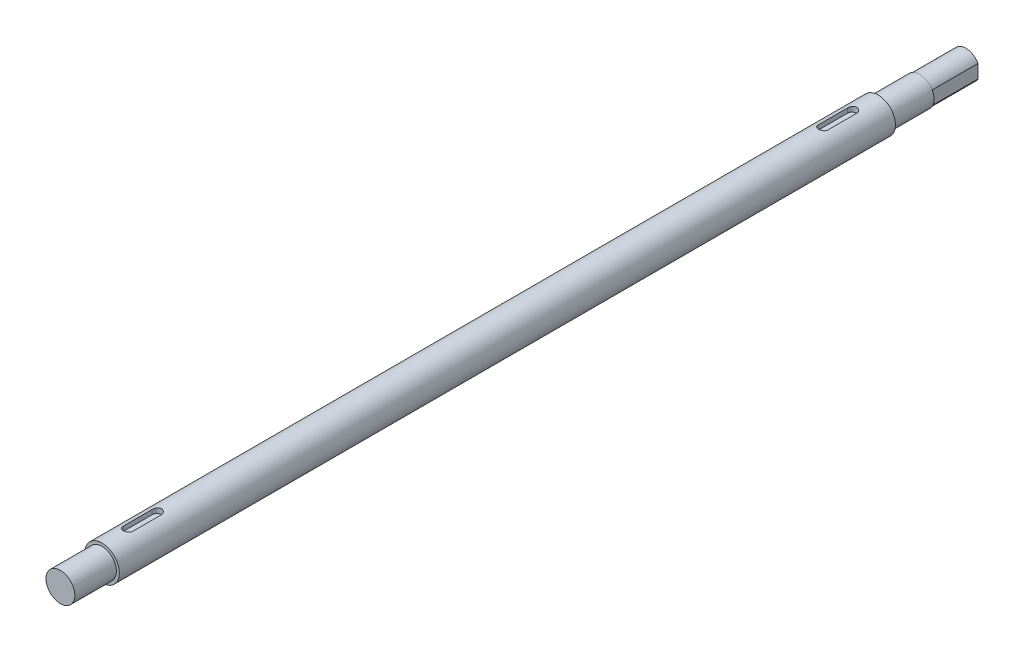
ISO-10303-21;
HEADER;
FILE_DESCRIPTION(('STEP AP214'),'2;1');
FILE_NAME('part.step','',(''),(''),'','','');
FILE_SCHEMA(('AUTOMOTIVE_DESIGN { 1 0 10303 214 1 1 1 1 }'));
ENDSEC;
DATA;
#1=APPLICATION_CONTEXT('core data for automotive mechanical design processes');
#2=APPLICATION_PROTOCOL_DEFINITION('international standard','automotive_design',2000,#1);
#3=PRODUCT_CONTEXT('',#1,'mechanical');
#4=PRODUCT('Part','Part','',(#3));
#5=PRODUCT_RELATED_PRODUCT_CATEGORY('part','',(#4));
#6=PRODUCT_DEFINITION_FORMATION('','',#4);
#7=PRODUCT_DEFINITION_CONTEXT('part definition',#1,'design');
#8=PRODUCT_DEFINITION('design','',#6,#7);
#9=PRODUCT_DEFINITION_SHAPE('','',#8);
#10=(LENGTH_UNIT() NAMED_UNIT(*) SI_UNIT(.MILLI.,.METRE.));
#11=(NAMED_UNIT(*) PLANE_ANGLE_UNIT() SI_UNIT($,.RADIAN.));
#12=(NAMED_UNIT(*) SI_UNIT($,.STERADIAN.) SOLID_ANGLE_UNIT());
#13=UNCERTAINTY_MEASURE_WITH_UNIT(LENGTH_MEASURE(1.E-05),#10,'distance_accuracy_value','');
#14=(GEOMETRIC_REPRESENTATION_CONTEXT(3) GLOBAL_UNCERTAINTY_ASSIGNED_CONTEXT((#13)) GLOBAL_UNIT_ASSIGNED_CONTEXT((#10,
#11,#12)) REPRESENTATION_CONTEXT('',''));
#15=CARTESIAN_POINT('',(0.,0.,0.));
#16=DIRECTION('',(0.,0.,1.));
#17=DIRECTION('',(1.,0.,0.));
#18=AXIS2_PLACEMENT_3D('',#15,#16,#17);
#19=CARTESIAN_POINT('',(0.,0.,-36.));
#20=DIRECTION('',(0.,0.,-1.));
#21=DIRECTION('',(-1.,0.,0.));
#22=AXIS2_PLACEMENT_3D('',#19,#20,#21);
#23=CYLINDRICAL_SURFACE('',#22,12.);
#24=DIRECTION('',(0.,0.,-1.));
#25=VECTOR('',#24,1.);
#26=CARTESIAN_POINT('',(-10.5,-5.80947501931113,-36.));
#27=LINE('',#26,#25);
#28=CARTESIAN_POINT('',(-10.5,-5.80947501931113,-76.));
#29=VERTEX_POINT('',#28);
#30=CARTESIAN_POINT('',(-10.5,-5.80947501931113,-36.));
#31=VERTEX_POINT('',#30);
#32=EDGE_CURVE('E249',#29,#31,#27,.F.);
#33=ORIENTED_EDGE('',*,*,#32,.F.);
#34=CARTESIAN_POINT('',(0.,0.,-76.));
#35=DIRECTION('',(0.,0.,-1.));
#36=DIRECTION('',(-1.,0.,0.));
#37=AXIS2_PLACEMENT_3D('',#34,#35,#36);
#38=CIRCLE('',#37,12.);
#39=CARTESIAN_POINT('',(10.5,-5.80947501931113,-76.));
#40=VERTEX_POINT('',#39);
#41=EDGE_CURVE('E251',#40,#29,#38,.T.);
#42=ORIENTED_EDGE('',*,*,#41,.F.);
#43=DIRECTION('',(0.,0.,-1.));
#44=VECTOR('',#43,1.);
#45=CARTESIAN_POINT('',(10.5,-5.80947501931113,-36.));
#46=LINE('',#45,#44);
#47=CARTESIAN_POINT('',(10.5,-5.80947501931113,-36.));
#48=VERTEX_POINT('',#47);
#49=EDGE_CURVE('E56',#48,#40,#46,.T.);
#50=ORIENTED_EDGE('',*,*,#49,.F.);
#51=CARTESIAN_POINT('',(0.,0.,-36.));
#52=DIRECTION('',(0.,0.,-1.));
#53=DIRECTION('',(-1.,0.,0.));
#54=AXIS2_PLACEMENT_3D('',#51,#52,#53);
#55=CIRCLE('',#54,12.);
#56=EDGE_CURVE('E145',#48,#31,#55,.T.);
#57=ORIENTED_EDGE('',*,*,#56,.T.);
#58=EDGE_LOOP('',(#33,#42,#50,#57));
#59=FACE_BOUND('',#58,.T.);
#60=ADVANCED_FACE('F40',(#59),#23,.T.);
#61=CARTESIAN_POINT('',(0.,0.,-90.));
#62=DIRECTION('',(0.,0.,1.));
#63=DIRECTION('',(1.,0.,0.));
#64=AXIS2_PLACEMENT_3D('',#61,#62,#63);
#65=CYLINDRICAL_SURFACE('',#64,12.5);
#66=CARTESIAN_POINT('',(0.,0.,0.));
#67=DIRECTION('',(0.,0.,1.));
#68=DIRECTION('',(1.,0.,0.));
#69=AXIS2_PLACEMENT_3D('',#66,#67,#68);
#70=CIRCLE('',#69,12.5);
#71=CARTESIAN_POINT('',(12.5,0.,0.));
#72=VERTEX_POINT('',#71);
#73=EDGE_CURVE('E175',#72,#72,#70,.F.);
#74=CARTESIAN_POINT('',(0.,0.,-36.));
#75=DIRECTION('',(0.,0.,-1.));
#76=DIRECTION('',(-1.,0.,0.));
#77=AXIS2_PLACEMENT_3D('',#74,#75,#76);
#78=CIRCLE('',#77,12.5);
#79=CARTESIAN_POINT('',(12.5,0.,-36.));
#80=VERTEX_POINT('',#79);
#81=EDGE_CURVE('E151',#80,#80,#78,.T.);
#82=CARTESIAN_POINT('',(12.5,0.,0.));
#83=CARTESIAN_POINT('',(12.5,0.,-0.375000000000014));
#84=CARTESIAN_POINT('',(12.5,0.,-0.750000000000015));
#85=CARTESIAN_POINT('',(12.5,0.,-1.50000000000002));
#86=CARTESIAN_POINT('',(12.5,0.,-1.87500000000002));
#87=CARTESIAN_POINT('',(12.5,0.,-2.62500000000002));
#88=CARTESIAN_POINT('',(12.5,0.,-3.00000000000002));
#89=CARTESIAN_POINT('',(12.5,0.,-3.75000000000002));
#90=CARTESIAN_POINT('',(12.5,0.,-4.12500000000002));
#91=CARTESIAN_POINT('',(12.5,0.,-4.87500000000001));
#92=CARTESIAN_POINT('',(12.5,0.,-5.25000000000001));
#93=CARTESIAN_POINT('',(12.5,0.,-6.00000000000001));
#94=CARTESIAN_POINT('',(12.5,0.,-6.37500000000001));
#95=CARTESIAN_POINT('',(12.5,0.,-7.12500000000001));
#96=CARTESIAN_POINT('',(12.5,0.,-7.50000000000001));
#97=CARTESIAN_POINT('',(12.5,0.,-8.25000000000001));
#98=CARTESIAN_POINT('',(12.5,0.,-8.62500000000001));
#99=CARTESIAN_POINT('',(12.5,0.,-9.37500000000001));
#100=CARTESIAN_POINT('',(12.5,0.,-9.75000000000001));
#101=CARTESIAN_POINT('',(12.5,0.,-10.5));
#102=CARTESIAN_POINT('',(12.5,0.,-10.875));
#103=CARTESIAN_POINT('',(12.5,0.,-11.625));
#104=CARTESIAN_POINT('',(12.5,0.,-12.));
#105=CARTESIAN_POINT('',(12.5,0.,-12.75));
#106=CARTESIAN_POINT('',(12.5,0.,-13.125));
#107=CARTESIAN_POINT('',(12.5,0.,-13.875));
#108=CARTESIAN_POINT('',(12.5,0.,-14.25));
#109=CARTESIAN_POINT('',(12.5,0.,-15.));
#110=CARTESIAN_POINT('',(12.5,0.,-15.375));
#111=CARTESIAN_POINT('',(12.5,0.,-16.125));
#112=CARTESIAN_POINT('',(12.5,0.,-16.5));
#113=CARTESIAN_POINT('',(12.5,0.,-17.25));
#114=CARTESIAN_POINT('',(12.5,0.,-17.625));
#115=CARTESIAN_POINT('',(12.5,0.,-18.375));
#116=CARTESIAN_POINT('',(12.5,0.,-18.75));
#117=CARTESIAN_POINT('',(12.5,0.,-19.5));
#118=CARTESIAN_POINT('',(12.5,0.,-19.875));
#119=CARTESIAN_POINT('',(12.5,0.,-20.625));
#120=CARTESIAN_POINT('',(12.5,0.,-21.));
#121=CARTESIAN_POINT('',(12.5,0.,-21.75));
#122=CARTESIAN_POINT('',(12.5,0.,-22.125));
#123=CARTESIAN_POINT('',(12.5,0.,-22.875));
#124=CARTESIAN_POINT('',(12.5,0.,-23.25));
#125=CARTESIAN_POINT('',(12.5,0.,-24.));
#126=CARTESIAN_POINT('',(12.5,0.,-24.375));
#127=CARTESIAN_POINT('',(12.5,0.,-25.125));
#128=CARTESIAN_POINT('',(12.5,0.,-25.5));
#129=CARTESIAN_POINT('',(12.5,0.,-26.25));
#130=CARTESIAN_POINT('',(12.5,0.,-26.625));
#131=CARTESIAN_POINT('',(12.5,0.,-27.375));
#132=CARTESIAN_POINT('',(12.5,0.,-27.75));
#133=CARTESIAN_POINT('',(12.5,0.,-28.5));
#134=CARTESIAN_POINT('',(12.5,0.,-28.875));
#135=CARTESIAN_POINT('',(12.5,0.,-29.625));
#136=CARTESIAN_POINT('',(12.5,0.,-30.));
#137=CARTESIAN_POINT('',(12.5,0.,-30.75));
#138=CARTESIAN_POINT('',(12.5,0.,-31.125));
#139=CARTESIAN_POINT('',(12.5,0.,-31.875));
#140=CARTESIAN_POINT('',(12.5,0.,-32.25));
#141=CARTESIAN_POINT('',(12.5,0.,-33.));
#142=CARTESIAN_POINT('',(12.5,0.,-33.375));
#143=CARTESIAN_POINT('',(12.5,0.,-34.125));
#144=CARTESIAN_POINT('',(12.5,0.,-34.5));
#145=CARTESIAN_POINT('',(12.5,0.,-35.25));
#146=CARTESIAN_POINT('',(12.5,0.,-35.625));
#147=CARTESIAN_POINT('',(12.5,0.,-36.));
#148=B_SPLINE_CURVE_WITH_KNOTS('',3,(#82,#83,#84,#85,#86,#87,#88,#89,#90,#91,#92,#93,#94,#95,
#96,#97,#98,#99,#100,#101,#102,#103,#104,#105,#106,#107,#108,#109,#110,#111,#112,#113,#114,#115,
#116,#117,#118,#119,#120,#121,#122,#123,#124,#125,#126,#127,#128,#129,#130,#131,#132,#133,#134,
#135,#136,#137,#138,#139,#140,#141,#142,#143,#144,#145,#146,#147),.UNSPECIFIED.,.F.,.F.,(4,2,2,
2,2,2,2,2,2,2,2,2,2,2,2,2,2,2,2,2,2,2,2,2,2,2,2,2,2,2,2,2,4),(0.,1.125,2.25,3.375,4.5,
5.62499999999999,6.74999999999999,7.87499999999999,8.99999999999999,10.125,11.25,12.375,13.5,
14.625,15.75,16.875,18.,19.125,20.25,21.375,22.5,23.625,24.75,25.875,27.,28.125,29.25,30.375,
31.5,32.625,33.75,34.875,36.),.UNSPECIFIED.);
#149=EDGE_CURVE('BSEAM222',#72,#80,#148,.T.);
#150=ORIENTED_EDGE('',*,*,#73,.T.);
#151=ORIENTED_EDGE('',*,*,#81,.F.);
#152=ORIENTED_EDGE('',*,*,#149,.T.);
#153=ORIENTED_EDGE('',*,*,#149,.F.);
#154=EDGE_LOOP('',(#150,#152,#151,#153));
#155=FACE_BOUND('',#154,.T.);
#156=ADVANCED_FACE('F222',(#155),#65,.T.);
#157=CARTESIAN_POINT('',(0.,0.,672.));
#158=DIRECTION('',(0.,0.,-1.));
#159=DIRECTION('',(-1.,0.,0.));
#160=AXIS2_PLACEMENT_3D('',#157,#158,#159);
#161=CYLINDRICAL_SURFACE('',#160,15.);
#162=CARTESIAN_POINT('',(0.,15.,653.5));
#163=CARTESIAN_POINT('',(-0.220509111665708,14.9999966762032,653.49999476613));
#164=CARTESIAN_POINT('',(-0.441074320443683,14.995089723243,653.481704771621));
#165=CARTESIAN_POINT('',(-0.875850902708934,14.9759914724332,653.409157538523));
#166=CARTESIAN_POINT('',(-1.09005916663818,14.9617957066517,653.354882991148));
#167=CARTESIAN_POINT('',(-1.50578317809062,14.9256866650558,653.212256666272));
#168=CARTESIAN_POINT('',(-1.70731490203056,14.9037833426075,653.123948824668));
#169=CARTESIAN_POINT('',(-2.09270737278531,14.8545739830336,652.915925514667));
#170=CARTESIAN_POINT('',(-2.27656694089927,14.8272675859036,652.796207953282));
#171=CARTESIAN_POINT('',(-2.62565900748008,14.7694922980399,652.525832967173));
#172=CARTESIAN_POINT('',(-2.79042337972562,14.7389693535736,652.374582663983));
#173=CARTESIAN_POINT('',(-3.09257427321279,14.6785481935918,652.046703033873));
#174=CARTESIAN_POINT('',(-3.22995726991331,14.6486500589449,651.870070444765));
#175=CARTESIAN_POINT('',(-3.47572818486831,14.5923107492874,651.492703530349));
#176=CARTESIAN_POINT('',(-3.58357755472976,14.5659377712648,651.291607343477));
#177=CARTESIAN_POINT('',(-3.76375096153989,14.5204295463637,650.873319777815));
#178=CARTESIAN_POINT('',(-3.83608154902739,14.5012929650653,650.656131375337));
#179=CARTESIAN_POINT('',(-3.94153840453008,14.472982316048,650.21700892435));
#180=CARTESIAN_POINT('',(-3.97551340489382,14.4635929562298,649.995292920139));
#181=CARTESIAN_POINT('',(-4.0059406941164,14.4551966183274,649.549124633387));
#182=CARTESIAN_POINT('',(-4.00239999411508,14.4561877002889,649.324672869952));
#183=CARTESIAN_POINT('',(-3.95857020005398,14.4682475760406,648.886029169252));
#184=CARTESIAN_POINT('',(-3.91930812129527,14.4790347102306,648.671725635923));
#185=CARTESIAN_POINT('',(-3.80679497444363,14.5090202616138,648.252863331088));
#186=CARTESIAN_POINT('',(-3.73354118985989,14.5282193510522,648.048305339849));
#187=CARTESIAN_POINT('',(-3.55428713930513,14.5731132349677,647.652063712383));
#188=CARTESIAN_POINT('',(-3.44792682275569,14.5988788563741,647.460551321428));
#189=CARTESIAN_POINT('',(-3.20573007647554,14.6539645928489,647.097731682297));
#190=CARTESIAN_POINT('',(-3.06988784448501,14.6832854071037,646.926428421687));
#191=CARTESIAN_POINT('',(-2.76733214526838,14.7433502125973,646.60302200509));
#192=CARTESIAN_POINT('',(-2.59975625456601,14.7741094297766,646.45172736337));
#193=CARTESIAN_POINT('',(-2.24123533641276,14.8327276255263,646.179222439299));
#194=CARTESIAN_POINT('',(-2.05028938841015,14.8605864897711,646.058013342595));
#195=CARTESIAN_POINT('',(-1.64919651099486,14.9104364079659,645.848764194351));
#196=CARTESIAN_POINT('',(-1.43896980510356,14.9324014566712,645.760870459103));
#197=CARTESIAN_POINT('',(-1.00600458878078,14.96780088802,645.621905622373));
#198=CARTESIAN_POINT('',(-0.783268823856604,14.981237134675,645.570826474552));
#199=CARTESIAN_POINT('',(-0.338508166290965,14.9977831711677,645.508210246164));
#200=CARTESIAN_POINT('',(-0.116648475282702,15.0011799494192,645.495573920298));
#201=CARTESIAN_POINT('',(0.326020091802439,14.9980894338339,645.507166328494));
#202=CARTESIAN_POINT('',(0.54682907412426,14.9916031616071,645.531391252212));
#203=CARTESIAN_POINT('',(0.977204899803595,14.9696607099204,645.61511689492));
#204=CARTESIAN_POINT('',(1.18689970405561,14.9543605309265,645.674004492396));
#205=CARTESIAN_POINT('',(1.59341394235218,14.9165258978828,645.824671889016));
#206=CARTESIAN_POINT('',(1.79023197843209,14.8939906599234,645.916455252501));
#207=CARTESIAN_POINT('',(2.16967694933592,14.8435132111904,646.132347774361));
#208=CARTESIAN_POINT('',(2.35195037692239,14.8154737320985,646.257054933596));
#209=CARTESIAN_POINT('',(2.69336927079432,14.7572290473119,646.534503260316));
#210=CARTESIAN_POINT('',(2.85251015759838,14.7270234145527,646.687249965202));
#211=CARTESIAN_POINT('',(3.14777848957547,14.6667949173317,647.021571154989));
#212=CARTESIAN_POINT('',(3.28313038499629,14.6368012285772,647.203837122791));
#213=CARTESIAN_POINT('',(3.52134382370244,14.5813289436636,647.589129392199));
#214=CARTESIAN_POINT('',(3.62420672244344,14.5558501591602,647.792154827244));
#215=CARTESIAN_POINT('',(3.79374823172207,14.5125853674305,648.212190614153));
#216=CARTESIAN_POINT('',(3.86063624507843,14.4947549662348,648.429111623638));
#217=CARTESIAN_POINT('',(3.95682410237658,14.4687965026614,648.871678639347));
#218=CARTESIAN_POINT('',(3.98613355205236,14.4606659608681,649.097322400687));
#219=CARTESIAN_POINT('',(4.00577979307211,14.4552348910192,649.542989575789));
#220=CARTESIAN_POINT('',(3.99736311235128,14.4575879532022,649.762954640573));
#221=CARTESIAN_POINT('',(3.94468751999859,14.4720479199639,650.198207028071));
#222=CARTESIAN_POINT('',(3.90042953069981,14.4841545735456,650.41349447101));
#223=CARTESIAN_POINT('',(3.77805031399793,14.5165514219021,650.83171150424));
#224=CARTESIAN_POINT('',(3.70019322151264,14.5367777005106,651.034723685459));
#225=CARTESIAN_POINT('',(3.51303109124665,14.5831363626058,651.424957661074));
#226=CARTESIAN_POINT('',(3.40372112049205,14.6092696723953,651.612176972602));
#227=CARTESIAN_POINT('',(3.15297818537663,14.6654584288421,651.971460718992));
#228=CARTESIAN_POINT('',(3.01069459535825,14.6956066620426,652.142917069952));
#229=CARTESIAN_POINT('',(2.69966107022187,14.7559100756513,652.459924903335));
#230=CARTESIAN_POINT('',(2.53090470871741,14.7860652559664,652.605470077338));
#231=CARTESIAN_POINT('',(2.16735996217729,14.8437562480818,652.869584475294));
#232=CARTESIAN_POINT('',(1.97209192350344,14.8712222262917,652.987510021299));
#233=CARTESIAN_POINT('',(1.56377728083368,14.9196762020573,653.188674831859));
#234=CARTESIAN_POINT('',(1.35074218939255,14.9406683536717,653.271936351327));
#235=CARTESIAN_POINT('',(0.948749409761994,14.9710950502695,653.390550570831));
#236=CARTESIAN_POINT('',(0.761524033130081,14.9818554118521,653.431498767185));
#237=CARTESIAN_POINT('',(0.382879590634158,14.9963089807291,653.486224412334));
#238=CARTESIAN_POINT('',(0.191460940809724,15.0000028859454,653.5000045444));
#239=CARTESIAN_POINT('',(0.,15.,653.5));
#240=B_SPLINE_CURVE_WITH_KNOTS('',3,(#162,#163,#164,#165,#166,#167,#168,#169,#170,#171,#172,
#173,#174,#175,#176,#177,#178,#179,#180,#181,#182,#183,#184,#185,#186,#187,#188,#189,#190,#191,
#192,#193,#194,#195,#196,#197,#198,#199,#200,#201,#202,#203,#204,#205,#206,#207,#208,#209,#210,
#211,#212,#213,#214,#215,#216,#217,#218,#219,#220,#221,#222,#223,#224,#225,#226,#227,#228,#229,
#230,#231,#232,#233,#234,#235,#236,#237,#238,#239),.UNSPECIFIED.,.T.,.F.,(4,2,2,2,2,2,2,2,2,2,2,
2,2,2,2,2,2,2,2,2,2,2,2,2,2,2,2,2,2,2,2,2,2,2,2,2,2,2,4),(0.,0.660825197899134,1.32196848752292,
1.98226110594387,2.64259773417352,3.31669795909943,3.99088489850297,4.67665165046461,
5.36229188259403,6.03244316500924,6.7024692080864,7.35382004092,8.00522293625882,8.66397346693,
9.32285376235257,10.0032251962464,10.683623438752,11.3669761920608,12.0501795438028,
12.713654350491,13.377060578507,14.0290707128423,14.6811515155123,15.346005720091,
16.0109913651778,16.6947299276557,17.3784399604821,18.0581259539879,18.7376381732797,
19.3948668481089,20.0520786104838,20.7042153090379,21.3564543425319,22.0278867914997,
22.6994824867209,23.38544504569,24.0709665229755,24.6447963799386,25.2185695593995),.UNSPECIFIED.);
#241=CARTESIAN_POINT('',(4.,14.456832294801,649.5));
#242=VERTEX_POINT('',#241);
#243=CARTESIAN_POINT('',(-4.,14.456832294801,649.5));
#244=VERTEX_POINT('',#243);
#245=EDGE_CURVE('E278',#242,#244,#240,.T.);
#246=ORIENTED_EDGE('',*,*,#245,.T.);
#247=DIRECTION('',(0.,0.,-1.));
#248=VECTOR('',#247,1.);
#249=CARTESIAN_POINT('',(-4.,14.456832294801,672.));
#250=LINE('',#249,#248);
#251=CARTESIAN_POINT('',(-4.,14.456832294801,624.5));
#252=VERTEX_POINT('',#251);
#253=EDGE_CURVE('E265',#244,#252,#250,.T.);
#254=ORIENTED_EDGE('',*,*,#253,.T.);
#255=CARTESIAN_POINT('',(-4.,14.456832294801,624.5));
#256=CARTESIAN_POINT('',(-4.00001309389174,14.4568189842467,624.389641756596));
#257=CARTESIAN_POINT('',(-3.99543311151603,14.4580956467717,624.279291478007));
#258=CARTESIAN_POINT('',(-3.97718874589727,14.4631301353516,624.059421346034));
#259=CARTESIAN_POINT('',(-3.96352604983925,14.4668875005959,623.949901342241));
#260=CARTESIAN_POINT('',(-3.92725695741265,14.4767740441058,623.732698346486));
#261=CARTESIAN_POINT('',(-3.90466984692448,14.482898107258,623.625011912152));
#262=CARTESIAN_POINT('',(-3.85076543838186,14.4973231400467,623.412025139644));
#263=CARTESIAN_POINT('',(-3.81944798699437,14.5056241479174,623.306724843415));
#264=CARTESIAN_POINT('',(-3.71275643853686,14.5334412456827,622.995536581225));
#265=CARTESIAN_POINT('',(-3.62460332607936,14.5558829598252,622.794125066453));
#266=CARTESIAN_POINT('',(-3.41695780475821,14.6060171290377,622.408979240374));
#267=CARTESIAN_POINT('',(-3.29745504324309,14.6337113178034,622.225250796028));
#268=CARTESIAN_POINT('',(-3.02730320878016,14.6920016406366,621.876029423072));
#269=CARTESIAN_POINT('',(-2.87601544465626,14.7226489452442,621.711038159034));
#270=CARTESIAN_POINT('',(-2.54795832924038,14.7829523618628,621.408442433038));
#271=CARTESIAN_POINT('',(-2.37118484921257,14.8126083123117,621.270842417132));
#272=CARTESIAN_POINT('',(-1.99367199592162,14.8681604116921,621.024827869815));
#273=CARTESIAN_POINT('',(-1.792594148434,14.8939887414057,620.916916034422));
#274=CARTESIAN_POINT('',(-1.3743557555279,14.9383834129136,620.736627111039));
#275=CARTESIAN_POINT('',(-1.15719869214844,14.9569513215518,620.664242355223));
#276=CARTESIAN_POINT('',(-0.71823430736963,14.9843709217852,620.558690174831));
#277=CARTESIAN_POINT('',(-0.496647293428073,14.9934353394137,620.524662787106));
#278=CARTESIAN_POINT('',(-0.0507319917605573,15.0015705103632,620.494085686777));
#279=CARTESIAN_POINT('',(0.17359589196347,15.0006427191926,620.497530515808));
#280=CARTESIAN_POINT('',(0.612629502642177,14.9890534931376,620.541195686368));
#281=CARTESIAN_POINT('',(0.827435206418327,14.9786381919443,620.580486127656));
#282=CARTESIAN_POINT('',(1.24728467665106,14.9495347795912,620.693225150863));
#283=CARTESIAN_POINT('',(1.45232797980577,14.9308462762364,620.766675352151));
#284=CARTESIAN_POINT('',(1.84920963545355,14.8869312076945,620.946359966253));
#285=CARTESIAN_POINT('',(2.04089626466614,14.8616414267933,621.05291337223));
#286=CARTESIAN_POINT('',(2.40398441957144,14.8072486052897,621.295542768965));
#287=CARTESIAN_POINT('',(2.57538239000348,14.7781448982353,621.431623922183));
#288=CARTESIAN_POINT('',(2.89854935036782,14.7182294237973,621.734327971101));
#289=CARTESIAN_POINT('',(3.04955722400813,14.6873926412643,621.901758007894));
#290=CARTESIAN_POINT('',(3.32161448391788,14.6282716207251,622.260042840709));
#291=CARTESIAN_POINT('',(3.44265558078024,14.5999880903709,622.450904096481));
#292=CARTESIAN_POINT('',(3.59932937334137,14.5618587427771,622.751353283365));
#293=CARTESIAN_POINT('',(3.64754371945351,14.5498268172621,622.854288915041));
#294=CARTESIAN_POINT('',(3.7350941764333,14.5275984074125,623.064046321272));
#295=CARTESIAN_POINT('',(3.77443385857867,14.5174011851057,623.170866512463));
#296=CARTESIAN_POINT('',(3.84386783810503,14.4991713081511,623.38751941922));
#297=CARTESIAN_POINT('',(3.87397173088606,14.4911364080612,623.497348878193));
#298=CARTESIAN_POINT('',(3.92471856960776,14.4774747012191,623.719275221125));
#299=CARTESIAN_POINT('',(3.94536592495321,14.4718467722231,623.83137102282));
#300=CARTESIAN_POINT('',(3.97411378733403,14.4639761334309,624.036251024718));
#301=CARTESIAN_POINT('',(3.98382319960777,14.4613012625133,624.128796446167));
#302=CARTESIAN_POINT('',(3.99676420153356,14.4577275048596,624.31422535331));
#303=CARTESIAN_POINT('',(4.00000603663185,14.4568258092259,624.407108070433));
#304=CARTESIAN_POINT('',(4.,14.456832294801,624.5));
#305=B_SPLINE_CURVE_WITH_KNOTS('',3,(#255,#256,#257,#258,#259,#260,#261,#262,#263,#264,#265,
#266,#267,#268,#269,#270,#271,#272,#273,#274,#275,#276,#277,#278,#279,#280,#281,#282,#283,#284,
#285,#286,#287,#288,#289,#290,#291,#292,#293,#294,#295,#296,#297,#298,#299,#300,#301,#302,#303,
#304),.UNSPECIFIED.,.F.,.F.,(4,2,2,2,2,2,2,2,2,2,2,2,2,2,2,2,2,2,2,2,2,2,2,2,4),(0.,
0.330958670877884,0.661855880768397,0.992041890688508,1.32223370010826,1.98190700187186,
2.64179842357619,3.31649637536141,3.99130375261111,4.67691814590525,5.36238449759355,
6.03215661862347,6.70183117906691,7.35461236515046,8.0074244999636,8.666733407937,
9.32615767867959,10.0057598785671,10.6855498604334,11.0281077435252,11.3705275300853,
11.7125903499583,12.0544935096115,12.3335333037378,12.6121307120357),.UNSPECIFIED.);
#306=CARTESIAN_POINT('',(4.,14.456832294801,624.5));
#307=VERTEX_POINT('',#306);
#308=EDGE_CURVE('E270',#252,#307,#305,.T.);
#309=ORIENTED_EDGE('',*,*,#308,.T.);
#310=DIRECTION('',(0.,0.,-1.));
#311=VECTOR('',#310,1.);
#312=CARTESIAN_POINT('',(4.,14.456832294801,672.));
#313=LINE('',#312,#311);
#314=EDGE_CURVE('E275',#307,#242,#313,.F.);
#315=ORIENTED_EDGE('',*,*,#314,.T.);
#316=EDGE_LOOP('',(#246,#254,#309,#315));
#317=FACE_BOUND('',#316,.T.);
#318=CARTESIAN_POINT('',(0.,15.,51.5));
#319=CARTESIAN_POINT('',(-0.220509111665709,14.9999966762032,51.4999947661303));
#320=CARTESIAN_POINT('',(-0.441074320443681,14.995089723243,51.4817047716207));
#321=CARTESIAN_POINT('',(-0.875850902708927,14.9759914724332,51.4091575385226));
#322=CARTESIAN_POINT('',(-1.09005916663817,14.9617957066517,51.3548829911478));
#323=CARTESIAN_POINT('',(-1.50578317809062,14.9256866650558,51.212256666272));
#324=CARTESIAN_POINT('',(-1.70731490203057,14.9037833426075,51.123948824668));
#325=CARTESIAN_POINT('',(-2.09270737278532,14.8545739830336,50.9159255146668));
#326=CARTESIAN_POINT('',(-2.27656694089925,14.8272675859036,50.7962079532815));
#327=CARTESIAN_POINT('',(-2.62565900748003,14.7694922980399,50.5258329671733));
#328=CARTESIAN_POINT('',(-2.79042337972557,14.7389693535736,50.3745826639835));
#329=CARTESIAN_POINT('',(-3.09257427321275,14.6785481935918,50.0467030338733));
#330=CARTESIAN_POINT('',(-3.22995726991328,14.6486500589449,49.870070444765));
#331=CARTESIAN_POINT('',(-3.4757281848683,14.5923107492874,49.4927035303491));
#332=CARTESIAN_POINT('',(-3.58357755472974,14.5659377712648,49.2916073434766));
#333=CARTESIAN_POINT('',(-3.76375096153988,14.5204295463637,48.8733197778152));
#334=CARTESIAN_POINT('',(-3.83608154902738,14.5012929650653,48.6561313753372));
#335=CARTESIAN_POINT('',(-3.94153840453008,14.472982316048,48.21700892435));
#336=CARTESIAN_POINT('',(-3.97551340489383,14.4635929562298,47.9952929201386));
#337=CARTESIAN_POINT('',(-4.00594069411639,14.4551966183274,47.549124633387));
#338=CARTESIAN_POINT('',(-4.00239999411507,14.4561877002889,47.3246728699519));
#339=CARTESIAN_POINT('',(-3.95857020005398,14.4682475760406,46.8860291692519));
#340=CARTESIAN_POINT('',(-3.91930812129529,14.4790347102306,46.6717256359231));
#341=CARTESIAN_POINT('',(-3.80679497444365,14.5090202616138,46.2528633310875));
#342=CARTESIAN_POINT('',(-3.73354118985989,14.5282193510523,46.0483053398493));
#343=CARTESIAN_POINT('',(-3.55428713930511,14.5731132349677,45.6520637123829));
#344=CARTESIAN_POINT('',(-3.44792682275568,14.5988788563741,45.4605513214275));
#345=CARTESIAN_POINT('',(-3.20573007647555,14.6539645928489,45.097731682297));
#346=CARTESIAN_POINT('',(-3.06988784448502,14.6832854071037,44.9264284216871));
#347=CARTESIAN_POINT('',(-2.76733214526837,14.7433502125973,44.6030220050904));
#348=CARTESIAN_POINT('',(-2.59975625456598,14.7741094297766,44.4517273633701));
#349=CARTESIAN_POINT('',(-2.24123533641274,14.8327276255263,44.1792224392995));
#350=CARTESIAN_POINT('',(-2.05028938841018,14.8605864897711,44.0580133425952));
#351=CARTESIAN_POINT('',(-1.64919651099491,14.9104364079659,43.8487641943507));
#352=CARTESIAN_POINT('',(-1.43896980510358,14.9324014566712,43.7608704591028));
#353=CARTESIAN_POINT('',(-1.00600458878079,14.96780088802,43.6219056223733));
#354=CARTESIAN_POINT('',(-0.783268823856648,14.981237134675,43.5708264745521));
#355=CARTESIAN_POINT('',(-0.338508166291031,14.9977831711677,43.5082102461644));
#356=CARTESIAN_POINT('',(-0.116648475282761,15.0011799494192,43.4955739202983));
#357=CARTESIAN_POINT('',(0.326020091802397,14.9980894338339,43.5071663284939));
#358=CARTESIAN_POINT('',(0.546829074124227,14.9916031616071,43.5313912522116));
#359=CARTESIAN_POINT('',(0.977204899803559,14.9696607099204,43.61511689492));
#360=CARTESIAN_POINT('',(1.18689970405556,14.9543605309265,43.6740044923956));
#361=CARTESIAN_POINT('',(1.59341394235213,14.9165258978828,43.8246718890159));
#362=CARTESIAN_POINT('',(1.79023197843206,14.8939906599234,43.9164552525011));
#363=CARTESIAN_POINT('',(2.1696769493359,14.8435132111904,44.1323477743611));
#364=CARTESIAN_POINT('',(2.35195037692237,14.8154737320985,44.2570549335955));
#365=CARTESIAN_POINT('',(2.6933692707943,14.7572290473119,44.534503260316));
#366=CARTESIAN_POINT('',(2.85251015759838,14.7270234145527,44.6872499652021));
#367=CARTESIAN_POINT('',(3.14777848957547,14.6667949173317,45.0215711549892));
#368=CARTESIAN_POINT('',(3.28313038499627,14.6368012285772,45.2038371227906));
#369=CARTESIAN_POINT('',(3.52134382370242,14.5813289436636,45.5891293921991));
#370=CARTESIAN_POINT('',(3.62420672244342,14.5558501591602,45.792154827244));
#371=CARTESIAN_POINT('',(3.79374823172205,14.5125853674305,46.2121906141529));
#372=CARTESIAN_POINT('',(3.8606362450784,14.4947549662348,46.4291116236376));
#373=CARTESIAN_POINT('',(3.95682410237657,14.4687965026614,46.8716786393471));
#374=CARTESIAN_POINT('',(3.98613355205236,14.4606659608681,47.0973224006868));
#375=CARTESIAN_POINT('',(4.00577979307212,14.4552348910192,47.5429895757886));
#376=CARTESIAN_POINT('',(3.99736311235129,14.4575879532022,47.7629546405733));
#377=CARTESIAN_POINT('',(3.94468751999858,14.4720479199639,48.1982070280705));
#378=CARTESIAN_POINT('',(3.9004295306998,14.4841545735456,48.4134944710096));
#379=CARTESIAN_POINT('',(3.77805031399794,14.5165514219021,48.8317115042403));
#380=CARTESIAN_POINT('',(3.70019322151266,14.5367777005106,49.0347236854592));
#381=CARTESIAN_POINT('',(3.51303109124666,14.5831363626058,49.4249576610735));
#382=CARTESIAN_POINT('',(3.40372112049204,14.6092696723953,49.6121769726024));
#383=CARTESIAN_POINT('',(3.15297818537663,14.6654584288421,49.9714607189918));
#384=CARTESIAN_POINT('',(3.01069459535826,14.6956066620426,50.1429170699521));
#385=CARTESIAN_POINT('',(2.69966107022191,14.7559100756513,50.4599249033351));
#386=CARTESIAN_POINT('',(2.53090470871747,14.7860652559664,50.6054700773378));
#387=CARTESIAN_POINT('',(2.16735996217739,14.8437562480818,50.8695844752936));
#388=CARTESIAN_POINT('',(1.97209192350356,14.8712222262917,50.9875100212987));
#389=CARTESIAN_POINT('',(1.56377728083377,14.9196762020573,51.1886748318588));
#390=CARTESIAN_POINT('',(1.35074218939259,14.9406683536717,51.2719363513272));
#391=CARTESIAN_POINT('',(0.948749409761978,14.9710950502695,51.3905505708311));
#392=CARTESIAN_POINT('',(0.761524033130069,14.9818554118521,51.431498767185));
#393=CARTESIAN_POINT('',(0.382879590634151,14.9963089807291,51.4862244123342));
#394=CARTESIAN_POINT('',(0.19146094080972,15.0000028859454,51.5000045444001));
#395=CARTESIAN_POINT('',(0.,15.,51.5));
#396=B_SPLINE_CURVE_WITH_KNOTS('',3,(#318,#319,#320,#321,#322,#323,#324,#325,#326,#327,#328,
#329,#330,#331,#332,#333,#334,#335,#336,#337,#338,#339,#340,#341,#342,#343,#344,#345,#346,#347,
#348,#349,#350,#351,#352,#353,#354,#355,#356,#357,#358,#359,#360,#361,#362,#363,#364,#365,#366,
#367,#368,#369,#370,#371,#372,#373,#374,#375,#376,#377,#378,#379,#380,#381,#382,#383,#384,#385,
#386,#387,#388,#389,#390,#391,#392,#393,#394,#395),.UNSPECIFIED.,.T.,.F.,(4,2,2,2,2,2,2,2,2,2,2,
2,2,2,2,2,2,2,2,2,2,2,2,2,2,2,2,2,2,2,2,2,2,2,2,2,2,2,4),(0.,0.660825197899138,1.3219684875229,
1.98226110594386,2.6425977341735,3.31669795909933,3.99088489850297,4.67665165046458,
5.36229188259399,6.03244316500936,6.7024692080864,7.35382004091994,8.0052229362588,
8.66397346692997,9.3228537623526,10.0032251962464,10.6836234387519,11.3669761920608,
12.0501795438028,12.7136543504909,13.377060578507,14.0290707128423,14.6811515155123,
15.346005720091,16.0109913651777,16.6947299276558,17.3784399604822,18.0581259539877,
18.7376381732797,19.394866848109,20.0520786104838,20.7042153090379,21.3564543425319,
22.0278867914997,22.6994824867209,23.3854450456898,24.0709665229755,24.6447963799386,
25.2185695593995),.UNSPECIFIED.);
#397=CARTESIAN_POINT('',(4.00000000000001,14.456832294801,47.5));
#398=VERTEX_POINT('',#397);
#399=CARTESIAN_POINT('',(-4.,14.456832294801,47.5));
#400=VERTEX_POINT('',#399);
#401=EDGE_CURVE('E191',#398,#400,#396,.T.);
#402=ORIENTED_EDGE('',*,*,#401,.T.);
#403=DIRECTION('',(0.,0.,-1.));
#404=VECTOR('',#403,1.);
#405=CARTESIAN_POINT('',(-4.,14.456832294801,672.));
#406=LINE('',#405,#404);
#407=CARTESIAN_POINT('',(-4.,14.456832294801,22.5));
#408=VERTEX_POINT('',#407);
#409=EDGE_CURVE('E342',#400,#408,#406,.T.);
#410=ORIENTED_EDGE('',*,*,#409,.T.);
#411=CARTESIAN_POINT('',(-4.,14.456832294801,22.5));
#412=CARTESIAN_POINT('',(-4.00001309389174,14.4568189842467,22.3896417565959));
#413=CARTESIAN_POINT('',(-3.99543311151603,14.4580956467717,22.2792914780071));
#414=CARTESIAN_POINT('',(-3.97718874589725,14.4631301353517,22.0594213460339));
#415=CARTESIAN_POINT('',(-3.96352604983924,14.4668875005959,21.9499013422402));
#416=CARTESIAN_POINT('',(-3.92725695741263,14.4767740441058,21.7326983464859));
#417=CARTESIAN_POINT('',(-3.90466984692446,14.482898107258,21.6250119121517));
#418=CARTESIAN_POINT('',(-3.85076543838184,14.4973231400467,21.4120251396443));
#419=CARTESIAN_POINT('',(-3.81944798699437,14.5056241479174,21.3067248434146));
#420=CARTESIAN_POINT('',(-3.71275643853687,14.5334412456827,20.9955365812246));
#421=CARTESIAN_POINT('',(-3.62460332607936,14.5558829598252,20.7941250664525));
#422=CARTESIAN_POINT('',(-3.4169578047582,14.6060171290377,20.4089792403742));
#423=CARTESIAN_POINT('',(-3.29745504324307,14.6337113178035,20.2252507960275));
#424=CARTESIAN_POINT('',(-3.0273032087801,14.6920016406366,19.8760294230722));
#425=CARTESIAN_POINT('',(-2.87601544465619,14.7226489452442,19.7110381590342));
#426=CARTESIAN_POINT('',(-2.5479583292403,14.7829523618628,19.4084424330383));
#427=CARTESIAN_POINT('',(-2.3711848492125,14.8126083123117,19.2708424171316));
#428=CARTESIAN_POINT('',(-1.99367199592157,14.8681604116921,19.0248278698145));
#429=CARTESIAN_POINT('',(-1.79259414843398,14.8939887414057,18.9169160344217));
#430=CARTESIAN_POINT('',(-1.37435575552792,14.9383834129136,18.7366271110387));
#431=CARTESIAN_POINT('',(-1.15719869214849,14.9569513215518,18.6642423552231));
#432=CARTESIAN_POINT('',(-0.718234307369694,14.9843709217852,18.5586901748307));
#433=CARTESIAN_POINT('',(-0.496647293428129,14.9934353394137,18.5246627871063));
#434=CARTESIAN_POINT('',(-0.0507319917605982,15.0015705103632,18.494085686777));
#435=CARTESIAN_POINT('',(0.173595891963436,15.0006427191926,18.4975305158074));
#436=CARTESIAN_POINT('',(0.612629502642154,14.9890534931376,18.5411956863681));
#437=CARTESIAN_POINT('',(0.827435206418309,14.9786381919443,18.5804861276563));
#438=CARTESIAN_POINT('',(1.24728467665104,14.9495347795912,18.6932251508632));
#439=CARTESIAN_POINT('',(1.45232797980574,14.9308462762364,18.7666753521507));
#440=CARTESIAN_POINT('',(1.84920963545354,14.8869312076945,18.9463599662528));
#441=CARTESIAN_POINT('',(2.04089626466616,14.8616414267933,19.0529133722298));
#442=CARTESIAN_POINT('',(2.40398441957147,14.8072486052897,19.2955427689646));
#443=CARTESIAN_POINT('',(2.5753823900035,14.7781448982353,19.4316239221831));
#444=CARTESIAN_POINT('',(2.8985493503678,14.7182294237973,19.7343279711014));
#445=CARTESIAN_POINT('',(3.04955722400808,14.6873926412643,19.9017580078943));
#446=CARTESIAN_POINT('',(3.32161448391782,14.6282716207252,20.2600428407091));
#447=CARTESIAN_POINT('',(3.4426555807802,14.5999880903709,20.4509040964811));
#448=CARTESIAN_POINT('',(3.59932937334133,14.5618587427771,20.7513532833646));
#449=CARTESIAN_POINT('',(3.64754371945347,14.5498268172621,20.8542889150409));
#450=CARTESIAN_POINT('',(3.73509417643326,14.5275984074125,21.0640463212714));
#451=CARTESIAN_POINT('',(3.77443385857863,14.5174011851057,21.1708665124627));
#452=CARTESIAN_POINT('',(3.843867838105,14.4991713081511,21.3875194192201));
#453=CARTESIAN_POINT('',(3.87397173088603,14.4911364080612,21.4973488781929));
#454=CARTESIAN_POINT('',(3.92471856960774,14.4774747012191,21.7192752211249));
#455=CARTESIAN_POINT('',(3.9453659249532,14.4718467722231,21.8313710228199));
#456=CARTESIAN_POINT('',(3.97411378733402,14.4639761334309,22.0362510247179));
#457=CARTESIAN_POINT('',(3.98382319960777,14.4613012625133,22.1287964461673));
#458=CARTESIAN_POINT('',(3.99676420153356,14.4577275048596,22.3142253533098));
#459=CARTESIAN_POINT('',(4.00000603663184,14.4568258092259,22.4071080704324));
#460=CARTESIAN_POINT('',(4.,14.456832294801,22.5));
#461=B_SPLINE_CURVE_WITH_KNOTS('',3,(#411,#412,#413,#414,#415,#416,#417,#418,#419,#420,#421,
#422,#423,#424,#425,#426,#427,#428,#429,#430,#431,#432,#433,#434,#435,#436,#437,#438,#439,#440,
#441,#442,#443,#444,#445,#446,#447,#448,#449,#450,#451,#452,#453,#454,#455,#456,#457,#458,#459,
#460),.UNSPECIFIED.,.F.,.F.,(4,2,2,2,2,2,2,2,2,2,2,2,2,2,2,2,2,2,2,2,2,2,2,2,4),(0.,
0.330958670878051,0.661855880768517,0.992041890688577,1.32223370010825,1.9819070018718,
2.6417984235763,3.31649637536148,3.99130375261117,4.67691814590522,5.36238449759349,
6.03215661862341,6.70183117906688,7.35461236515044,8.00742449996357,8.66673340793702,
9.32615767867956,10.0057598785669,10.6855498604333,11.0281077435251,11.3705275300852,
11.7125903499581,12.0544935096114,12.3335333037377,12.6121307120356),.UNSPECIFIED.);
#462=CARTESIAN_POINT('',(4.,14.456832294801,22.5));
#463=VERTEX_POINT('',#462);
#464=EDGE_CURVE('E181',#408,#463,#461,.T.);
#465=ORIENTED_EDGE('',*,*,#464,.T.);
#466=DIRECTION('',(0.,0.,-1.));
#467=VECTOR('',#466,1.);
#468=CARTESIAN_POINT('',(4.,14.456832294801,672.));
#469=LINE('',#468,#467);
#470=EDGE_CURVE('E335',#463,#398,#469,.F.);
#471=ORIENTED_EDGE('',*,*,#470,.T.);
#472=EDGE_LOOP('',(#402,#410,#465,#471));
#473=FACE_BOUND('',#472,.T.);
#474=CARTESIAN_POINT('',(0.,0.,672.));
#475=DIRECTION('',(0.,0.,1.));
#476=DIRECTION('',(1.,0.,0.));
#477=AXIS2_PLACEMENT_3D('',#474,#475,#476);
#478=CIRCLE('',#477,15.);
#479=CARTESIAN_POINT('',(15.,0.,672.));
#480=VERTEX_POINT('',#479);
#481=EDGE_CURVE('E171',#480,#480,#478,.T.);
#482=ORIENTED_EDGE('',*,*,#481,.F.);
#483=EDGE_LOOP('',(#482));
#484=FACE_BOUND('',#483,.T.);
#485=CARTESIAN_POINT('',(0.,0.,0.));
#486=DIRECTION('',(0.,0.,1.));
#487=DIRECTION('',(1.,0.,0.));
#488=AXIS2_PLACEMENT_3D('',#485,#486,#487);
#489=CIRCLE('',#488,15.);
#490=CARTESIAN_POINT('',(15.,0.,0.));
#491=VERTEX_POINT('',#490);
#492=EDGE_CURVE('E167',#491,#491,#489,.T.);
#493=ORIENTED_EDGE('',*,*,#492,.T.);
#494=EDGE_LOOP('',(#493));
#495=FACE_BOUND('',#494,.T.);
#496=ADVANCED_FACE('F197',(#317,#473,#484,#495),#161,.T.);
#497=CARTESIAN_POINT('',(0.,0.,672.));
#498=DIRECTION('',(0.,0.,1.));
#499=DIRECTION('',(1.,0.,0.));
#500=AXIS2_PLACEMENT_3D('',#497,#498,#499);
#501=PLANE('',#500);
#502=CARTESIAN_POINT('',(0.,0.,672.));
#503=DIRECTION('',(0.,0.,1.));
#504=DIRECTION('',(1.,0.,0.));
#505=AXIS2_PLACEMENT_3D('',#502,#503,#504);
#506=CIRCLE('',#505,12.5);
#507=CARTESIAN_POINT('',(12.5,0.,672.));
#508=VERTEX_POINT('',#507);
#509=EDGE_CURVE('E156',#508,#508,#506,.T.);
#510=ORIENTED_EDGE('',*,*,#509,.F.);
#511=EDGE_LOOP('',(#510));
#512=FACE_BOUND('',#511,.T.);
#513=ORIENTED_EDGE('',*,*,#481,.T.);
#514=EDGE_LOOP('',(#513));
#515=FACE_BOUND('',#514,.T.);
#516=ADVANCED_FACE('F234',(#512,#515),#501,.T.);
#517=CARTESIAN_POINT('',(0.,0.,0.));
#518=DIRECTION('',(0.,0.,1.));
#519=DIRECTION('',(1.,0.,0.));
#520=AXIS2_PLACEMENT_3D('',#517,#518,#519);
#521=PLANE('',#520);
#522=ORIENTED_EDGE('',*,*,#73,.F.);
#523=EDGE_LOOP('',(#522));
#524=FACE_BOUND('',#523,.T.);
#525=ORIENTED_EDGE('',*,*,#492,.F.);
#526=EDGE_LOOP('',(#525));
#527=FACE_BOUND('',#526,.T.);
#528=ADVANCED_FACE('F232',(#524,#527),#521,.F.);
#529=CARTESIAN_POINT('',(0.,0.,708.));
#530=DIRECTION('',(0.,0.,-1.));
#531=DIRECTION('',(-1.,0.,0.));
#532=AXIS2_PLACEMENT_3D('',#529,#530,#531);
#533=CYLINDRICAL_SURFACE('',#532,12.5);
#534=CARTESIAN_POINT('',(0.,0.,708.));
#535=DIRECTION('',(0.,0.,1.));
#536=DIRECTION('',(1.,0.,0.));
#537=AXIS2_PLACEMENT_3D('',#534,#535,#536);
#538=CIRCLE('',#537,12.5);
#539=CARTESIAN_POINT('',(12.5,0.,708.));
#540=VERTEX_POINT('',#539);
#541=EDGE_CURVE('E163',#540,#540,#538,.T.);
#542=ORIENTED_EDGE('',*,*,#541,.F.);
#543=EDGE_LOOP('',(#542));
#544=FACE_BOUND('',#543,.T.);
#545=ORIENTED_EDGE('',*,*,#509,.T.);
#546=EDGE_LOOP('',(#545));
#547=FACE_BOUND('',#546,.T.);
#548=ADVANCED_FACE('F228',(#544,#547),#533,.T.);
#549=CARTESIAN_POINT('',(0.,0.,708.));
#550=DIRECTION('',(0.,0.,1.));
#551=DIRECTION('',(1.,0.,0.));
#552=AXIS2_PLACEMENT_3D('',#549,#550,#551);
#553=PLANE('',#552);
#554=ORIENTED_EDGE('',*,*,#541,.T.);
#555=EDGE_LOOP('',(#554));
#556=FACE_BOUND('',#555,.T.);
#557=ADVANCED_FACE('F221',(#556),#553,.T.);
#558=CARTESIAN_POINT('',(0.,0.,-36.));
#559=DIRECTION('',(0.,0.,-1.));
#560=DIRECTION('',(-1.,0.,0.));
#561=AXIS2_PLACEMENT_3D('',#558,#559,#560);
#562=PLANE('',#561);
#563=CARTESIAN_POINT('',(-10.5,5.80947501931113,-36.));
#564=VERTEX_POINT('',#563);
#565=CARTESIAN_POINT('',(10.5,5.80947501931112,-36.));
#566=VERTEX_POINT('',#565);
#567=EDGE_CURVE('E143',#564,#566,#55,.T.);
#568=ORIENTED_EDGE('',*,*,#567,.F.);
#569=DIRECTION('',(0.,1.,0.));
#570=VECTOR('',#569,1.);
#571=CARTESIAN_POINT('',(-10.5,-9.,-36.));
#572=LINE('',#571,#570);
#573=EDGE_CURVE('E147',#31,#564,#572,.T.);
#574=ORIENTED_EDGE('',*,*,#573,.F.);
#575=ORIENTED_EDGE('',*,*,#56,.F.);
#576=DIRECTION('',(0.,-1.,0.));
#577=VECTOR('',#576,1.);
#578=CARTESIAN_POINT('',(10.5,-9.,-36.));
#579=LINE('',#578,#577);
#580=EDGE_CURVE('E130',#566,#48,#579,.T.);
#581=ORIENTED_EDGE('',*,*,#580,.F.);
#582=EDGE_LOOP('',(#568,#574,#575,#581));
#583=FACE_BOUND('',#582,.T.);
#584=ORIENTED_EDGE('',*,*,#81,.T.);
#585=EDGE_LOOP('',(#584));
#586=FACE_BOUND('',#585,.T.);
#587=ADVANCED_FACE('F140',(#583,#586),#562,.T.);
#588=DIRECTION('',(0.,0.,-1.));
#589=VECTOR('',#588,1.);
#590=CARTESIAN_POINT('',(-10.5,5.80947501931113,-36.));
#591=LINE('',#590,#589);
#592=CARTESIAN_POINT('',(-10.5,5.80947501931113,-76.));
#593=VERTEX_POINT('',#592);
#594=EDGE_CURVE('E63',#564,#593,#591,.T.);
#595=ORIENTED_EDGE('',*,*,#594,.F.);
#596=ORIENTED_EDGE('',*,*,#567,.T.);
#597=DIRECTION('',(0.,0.,-1.));
#598=VECTOR('',#597,1.);
#599=CARTESIAN_POINT('',(10.5,5.80947501931112,-36.));
#600=LINE('',#599,#598);
#601=CARTESIAN_POINT('',(10.5,5.80947501931113,-76.));
#602=VERTEX_POINT('',#601);
#603=EDGE_CURVE('E127',#602,#566,#600,.F.);
#604=ORIENTED_EDGE('',*,*,#603,.F.);
#605=EDGE_CURVE('E158',#593,#602,#38,.T.);
#606=ORIENTED_EDGE('',*,*,#605,.F.);
#607=EDGE_LOOP('',(#595,#596,#604,#606));
#608=FACE_BOUND('',#607,.T.);
#609=ADVANCED_FACE('F149',(#608),#23,.T.);
#610=CARTESIAN_POINT('',(0.,0.,-76.));
#611=DIRECTION('',(0.,0.,-1.));
#612=DIRECTION('',(-1.,0.,0.));
#613=AXIS2_PLACEMENT_3D('',#610,#611,#612);
#614=PLANE('',#613);
#615=DIRECTION('',(0.,-1.,0.));
#616=VECTOR('',#615,1.);
#617=CARTESIAN_POINT('',(-10.5,0.,-76.));
#618=LINE('',#617,#616);
#619=EDGE_CURVE('E12',#593,#29,#618,.T.);
#620=ORIENTED_EDGE('',*,*,#619,.F.);
#621=ORIENTED_EDGE('',*,*,#605,.T.);
#622=DIRECTION('',(0.,1.,0.));
#623=VECTOR('',#622,1.);
#624=CARTESIAN_POINT('',(10.5,0.,-76.));
#625=LINE('',#624,#623);
#626=EDGE_CURVE('E49',#40,#602,#625,.T.);
#627=ORIENTED_EDGE('',*,*,#626,.F.);
#628=ORIENTED_EDGE('',*,*,#41,.T.);
#629=EDGE_LOOP('',(#620,#621,#627,#628));
#630=FACE_BOUND('',#629,.T.);
#631=ADVANCED_FACE('F42',(#630),#614,.T.);
#632=CARTESIAN_POINT('',(0.,10.5,47.5));
#633=DIRECTION('',(0.,1.,0.));
#634=DIRECTION('',(0.,0.,1.));
#635=AXIS2_PLACEMENT_3D('',#632,#633,#634);
#636=CYLINDRICAL_SURFACE('',#635,4.);
#637=ORIENTED_EDGE('',*,*,#401,.F.);
#638=DIRECTION('',(0.,1.,0.));
#639=VECTOR('',#638,1.);
#640=CARTESIAN_POINT('',(4.,10.5,47.5));
#641=LINE('',#640,#639);
#642=CARTESIAN_POINT('',(4.,10.5,47.5));
#643=VERTEX_POINT('',#642);
#644=EDGE_CURVE('E161',#643,#398,#641,.T.);
#645=ORIENTED_EDGE('',*,*,#644,.F.);
#646=CARTESIAN_POINT('',(0.,10.5,47.5));
#647=DIRECTION('',(0.,1.,0.));
#648=DIRECTION('',(0.,0.,-1.));
#649=AXIS2_PLACEMENT_3D('',#646,#647,#648);
#650=CIRCLE('',#649,4.);
#651=CARTESIAN_POINT('',(-4.,10.5,47.5));
#652=VERTEX_POINT('',#651);
#653=EDGE_CURVE('E253',#652,#643,#650,.T.);
#654=ORIENTED_EDGE('',*,*,#653,.F.);
#655=DIRECTION('',(0.,1.,0.));
#656=VECTOR('',#655,1.);
#657=CARTESIAN_POINT('',(-4.,10.5,47.5));
#658=LINE('',#657,#656);
#659=EDGE_CURVE('E321',#652,#400,#658,.T.);
#660=ORIENTED_EDGE('',*,*,#659,.T.);
#661=EDGE_LOOP('',(#637,#645,#654,#660));
#662=FACE_BOUND('',#661,.T.);
#663=ADVANCED_FACE('F212',(#662),#636,.F.);
#664=CARTESIAN_POINT('',(-4.,10.5,47.5));
#665=DIRECTION('',(-1.,0.,0.));
#666=DIRECTION('',(0.,0.,1.));
#667=AXIS2_PLACEMENT_3D('',#664,#665,#666);
#668=PLANE('',#667);
#669=ORIENTED_EDGE('',*,*,#659,.F.);
#670=DIRECTION('',(0.,0.,1.));
#671=VECTOR('',#670,1.);
#672=CARTESIAN_POINT('',(-4.,10.5,47.5));
#673=LINE('',#672,#671);
#674=CARTESIAN_POINT('',(-4.,10.5,22.5));
#675=VERTEX_POINT('',#674);
#676=EDGE_CURVE('E306',#675,#652,#673,.T.);
#677=ORIENTED_EDGE('',*,*,#676,.F.);
#678=DIRECTION('',(0.,1.,0.));
#679=VECTOR('',#678,1.);
#680=CARTESIAN_POINT('',(-4.,10.5,22.5));
#681=LINE('',#680,#679);
#682=EDGE_CURVE('E325',#675,#408,#681,.T.);
#683=ORIENTED_EDGE('',*,*,#682,.T.);
#684=ORIENTED_EDGE('',*,*,#409,.F.);
#685=EDGE_LOOP('',(#669,#677,#683,#684));
#686=FACE_BOUND('',#685,.T.);
#687=ADVANCED_FACE('F206',(#686),#668,.F.);
#688=CARTESIAN_POINT('',(0.,10.5,22.5));
#689=DIRECTION('',(0.,1.,0.));
#690=DIRECTION('',(0.,0.,1.));
#691=AXIS2_PLACEMENT_3D('',#688,#689,#690);
#692=CYLINDRICAL_SURFACE('',#691,4.);
#693=ORIENTED_EDGE('',*,*,#682,.F.);
#694=CARTESIAN_POINT('',(0.,10.5,22.5));
#695=DIRECTION('',(0.,1.,0.));
#696=DIRECTION('',(0.,0.,-1.));
#697=AXIS2_PLACEMENT_3D('',#694,#695,#696);
#698=CIRCLE('',#697,4.);
#699=CARTESIAN_POINT('',(4.,10.5,22.5));
#700=VERTEX_POINT('',#699);
#701=EDGE_CURVE('E311',#700,#675,#698,.T.);
#702=ORIENTED_EDGE('',*,*,#701,.F.);
#703=DIRECTION('',(0.,1.,0.));
#704=VECTOR('',#703,1.);
#705=CARTESIAN_POINT('',(4.,10.5,22.5));
#706=LINE('',#705,#704);
#707=EDGE_CURVE('E328',#700,#463,#706,.T.);
#708=ORIENTED_EDGE('',*,*,#707,.T.);
#709=ORIENTED_EDGE('',*,*,#464,.F.);
#710=EDGE_LOOP('',(#693,#702,#708,#709));
#711=FACE_BOUND('',#710,.T.);
#712=ADVANCED_FACE('F200',(#711),#692,.F.);
#713=CARTESIAN_POINT('',(4.,10.5,47.5));
#714=DIRECTION('',(1.,0.,0.));
#715=DIRECTION('',(0.,0.,-1.));
#716=AXIS2_PLACEMENT_3D('',#713,#714,#715);
#717=PLANE('',#716);
#718=ORIENTED_EDGE('',*,*,#707,.F.);
#719=DIRECTION('',(0.,0.,-1.));
#720=VECTOR('',#719,1.);
#721=CARTESIAN_POINT('',(4.,10.5,47.5));
#722=LINE('',#721,#720);
#723=EDGE_CURVE('E304',#643,#700,#722,.T.);
#724=ORIENTED_EDGE('',*,*,#723,.F.);
#725=ORIENTED_EDGE('',*,*,#644,.T.);
#726=ORIENTED_EDGE('',*,*,#470,.F.);
#727=EDGE_LOOP('',(#718,#724,#725,#726));
#728=FACE_BOUND('',#727,.T.);
#729=ADVANCED_FACE('F205',(#728),#717,.F.);
#730=CARTESIAN_POINT('',(0.,10.5,47.5));
#731=DIRECTION('',(0.,-1.,0.));
#732=DIRECTION('',(0.,0.,-1.));
#733=AXIS2_PLACEMENT_3D('',#730,#731,#732);
#734=PLANE('',#733);
#735=ORIENTED_EDGE('',*,*,#653,.T.);
#736=ORIENTED_EDGE('',*,*,#723,.T.);
#737=ORIENTED_EDGE('',*,*,#701,.T.);
#738=ORIENTED_EDGE('',*,*,#676,.T.);
#739=EDGE_LOOP('',(#735,#736,#737,#738));
#740=FACE_BOUND('',#739,.T.);
#741=ADVANCED_FACE('F210',(#740),#734,.F.);
#742=CARTESIAN_POINT('',(0.,10.5,624.5));
#743=DIRECTION('',(0.,1.,0.));
#744=DIRECTION('',(0.,0.,1.));
#745=AXIS2_PLACEMENT_3D('',#742,#743,#744);
#746=CYLINDRICAL_SURFACE('',#745,4.);
#747=DIRECTION('',(0.,1.,0.));
#748=VECTOR('',#747,1.);
#749=CARTESIAN_POINT('',(-4.,10.5,624.5));
#750=LINE('',#749,#748);
#751=CARTESIAN_POINT('',(-4.,10.5,624.5));
#752=VERTEX_POINT('',#751);
#753=EDGE_CURVE('E314',#752,#252,#750,.T.);
#754=ORIENTED_EDGE('',*,*,#753,.F.);
#755=CARTESIAN_POINT('',(0.,10.5,624.5));
#756=DIRECTION('',(0.,1.,0.));
#757=DIRECTION('',(0.,0.,1.));
#758=AXIS2_PLACEMENT_3D('',#755,#756,#757);
#759=CIRCLE('',#758,4.);
#760=CARTESIAN_POINT('',(4.,10.5,624.5));
#761=VERTEX_POINT('',#760);
#762=EDGE_CURVE('E324',#761,#752,#759,.T.);
#763=ORIENTED_EDGE('',*,*,#762,.F.);
#764=DIRECTION('',(0.,1.,0.));
#765=VECTOR('',#764,1.);
#766=CARTESIAN_POINT('',(4.,10.5,624.5));
#767=LINE('',#766,#765);
#768=EDGE_CURVE('E257',#761,#307,#767,.T.);
#769=ORIENTED_EDGE('',*,*,#768,.T.);
#770=ORIENTED_EDGE('',*,*,#308,.F.);
#771=EDGE_LOOP('',(#754,#763,#769,#770));
#772=FACE_BOUND('',#771,.T.);
#773=ADVANCED_FACE('F286',(#772),#746,.F.);
#774=CARTESIAN_POINT('',(4.,10.5,624.5));
#775=DIRECTION('',(1.,0.,0.));
#776=DIRECTION('',(0.,0.,-1.));
#777=AXIS2_PLACEMENT_3D('',#774,#775,#776);
#778=PLANE('',#777);
#779=ORIENTED_EDGE('',*,*,#768,.F.);
#780=DIRECTION('',(0.,0.,-1.));
#781=VECTOR('',#780,1.);
#782=CARTESIAN_POINT('',(4.,10.5,624.5));
#783=LINE('',#782,#781);
#784=CARTESIAN_POINT('',(4.,10.5,649.5));
#785=VERTEX_POINT('',#784);
#786=EDGE_CURVE('E513',#785,#761,#783,.T.);
#787=ORIENTED_EDGE('',*,*,#786,.F.);
#788=DIRECTION('',(0.,1.,0.));
#789=VECTOR('',#788,1.);
#790=CARTESIAN_POINT('',(4.,10.5,649.5));
#791=LINE('',#790,#789);
#792=EDGE_CURVE('E262',#785,#242,#791,.T.);
#793=ORIENTED_EDGE('',*,*,#792,.T.);
#794=ORIENTED_EDGE('',*,*,#314,.F.);
#795=EDGE_LOOP('',(#779,#787,#793,#794));
#796=FACE_BOUND('',#795,.T.);
#797=ADVANCED_FACE('F290',(#796),#778,.F.);
#798=CARTESIAN_POINT('',(0.,10.5,649.5));
#799=DIRECTION('',(0.,1.,0.));
#800=DIRECTION('',(0.,0.,1.));
#801=AXIS2_PLACEMENT_3D('',#798,#799,#800);
#802=CYLINDRICAL_SURFACE('',#801,4.);
#803=ORIENTED_EDGE('',*,*,#245,.F.);
#804=ORIENTED_EDGE('',*,*,#792,.F.);
#805=CARTESIAN_POINT('',(0.,10.5,649.5));
#806=DIRECTION('',(0.,1.,0.));
#807=DIRECTION('',(0.,0.,1.));
#808=AXIS2_PLACEMENT_3D('',#805,#806,#807);
#809=CIRCLE('',#808,4.);
#810=CARTESIAN_POINT('',(-4.,10.5,649.5));
#811=VERTEX_POINT('',#810);
#812=EDGE_CURVE('E507',#811,#785,#809,.T.);
#813=ORIENTED_EDGE('',*,*,#812,.F.);
#814=DIRECTION('',(0.,1.,0.));
#815=VECTOR('',#814,1.);
#816=CARTESIAN_POINT('',(-4.,10.5,649.5));
#817=LINE('',#816,#815);
#818=EDGE_CURVE('E504',#811,#244,#817,.T.);
#819=ORIENTED_EDGE('',*,*,#818,.T.);
#820=EDGE_LOOP('',(#803,#804,#813,#819));
#821=FACE_BOUND('',#820,.T.);
#822=ADVANCED_FACE('F349',(#821),#802,.F.);
#823=CARTESIAN_POINT('',(-4.,10.5,624.5));
#824=DIRECTION('',(-1.,0.,0.));
#825=DIRECTION('',(0.,0.,1.));
#826=AXIS2_PLACEMENT_3D('',#823,#824,#825);
#827=PLANE('',#826);
#828=ORIENTED_EDGE('',*,*,#818,.F.);
#829=DIRECTION('',(0.,0.,1.));
#830=VECTOR('',#829,1.);
#831=CARTESIAN_POINT('',(-4.,10.5,624.5));
#832=LINE('',#831,#830);
#833=EDGE_CURVE('E520',#752,#811,#832,.T.);
#834=ORIENTED_EDGE('',*,*,#833,.F.);
#835=ORIENTED_EDGE('',*,*,#753,.T.);
#836=ORIENTED_EDGE('',*,*,#253,.F.);
#837=EDGE_LOOP('',(#828,#834,#835,#836));
#838=FACE_BOUND('',#837,.T.);
#839=ADVANCED_FACE('F292',(#838),#827,.F.);
#840=CARTESIAN_POINT('',(0.,10.5,624.5));
#841=DIRECTION('',(0.,1.,0.));
#842=DIRECTION('',(0.,0.,1.));
#843=AXIS2_PLACEMENT_3D('',#840,#841,#842);
#844=PLANE('',#843);
#845=ORIENTED_EDGE('',*,*,#762,.T.);
#846=ORIENTED_EDGE('',*,*,#833,.T.);
#847=ORIENTED_EDGE('',*,*,#812,.T.);
#848=ORIENTED_EDGE('',*,*,#786,.T.);
#849=EDGE_LOOP('',(#845,#846,#847,#848));
#850=FACE_BOUND('',#849,.T.);
#851=ADVANCED_FACE('F357',(#850),#844,.T.);
#852=CARTESIAN_POINT('',(10.5,-9.,-17.5609110854142));
#853=DIRECTION('',(-1.,0.,0.));
#854=DIRECTION('',(0.,-1.,0.));
#855=AXIS2_PLACEMENT_3D('',#852,#853,#854);
#856=PLANE('',#855);
#857=ORIENTED_EDGE('',*,*,#603,.T.);
#858=ORIENTED_EDGE('',*,*,#580,.T.);
#859=ORIENTED_EDGE('',*,*,#49,.T.);
#860=ORIENTED_EDGE('',*,*,#626,.T.);
#861=EDGE_LOOP('',(#857,#858,#859,#860));
#862=FACE_BOUND('',#861,.T.);
#863=ADVANCED_FACE('F129',(#862),#856,.F.);
#864=CARTESIAN_POINT('',(-10.5,-9.,-17.5609110854142));
#865=DIRECTION('',(1.,0.,0.));
#866=DIRECTION('',(0.,1.,0.));
#867=AXIS2_PLACEMENT_3D('',#864,#865,#866);
#868=PLANE('',#867);
#869=ORIENTED_EDGE('',*,*,#32,.T.);
#870=ORIENTED_EDGE('',*,*,#573,.T.);
#871=ORIENTED_EDGE('',*,*,#594,.T.);
#872=ORIENTED_EDGE('',*,*,#619,.T.);
#873=EDGE_LOOP('',(#869,#870,#871,#872));
#874=FACE_BOUND('',#873,.T.);
#875=ADVANCED_FACE('F363',(#874),#868,.F.);
#876=CLOSED_SHELL('',(#60,#156,#496,#516,#528,#548,#557,#587,#609,#631,#663,#687,#712,#729,#741,
#773,#797,#822,#839,#851,#863,#875));
#877=MANIFOLD_SOLID_BREP('B2',#876);
#878=ADVANCED_BREP_SHAPE_REPRESENTATION('',(#18,#877),#14);
#879=SHAPE_DEFINITION_REPRESENTATION(#9,#878);
ENDSEC;
END-ISO-10303-21;
